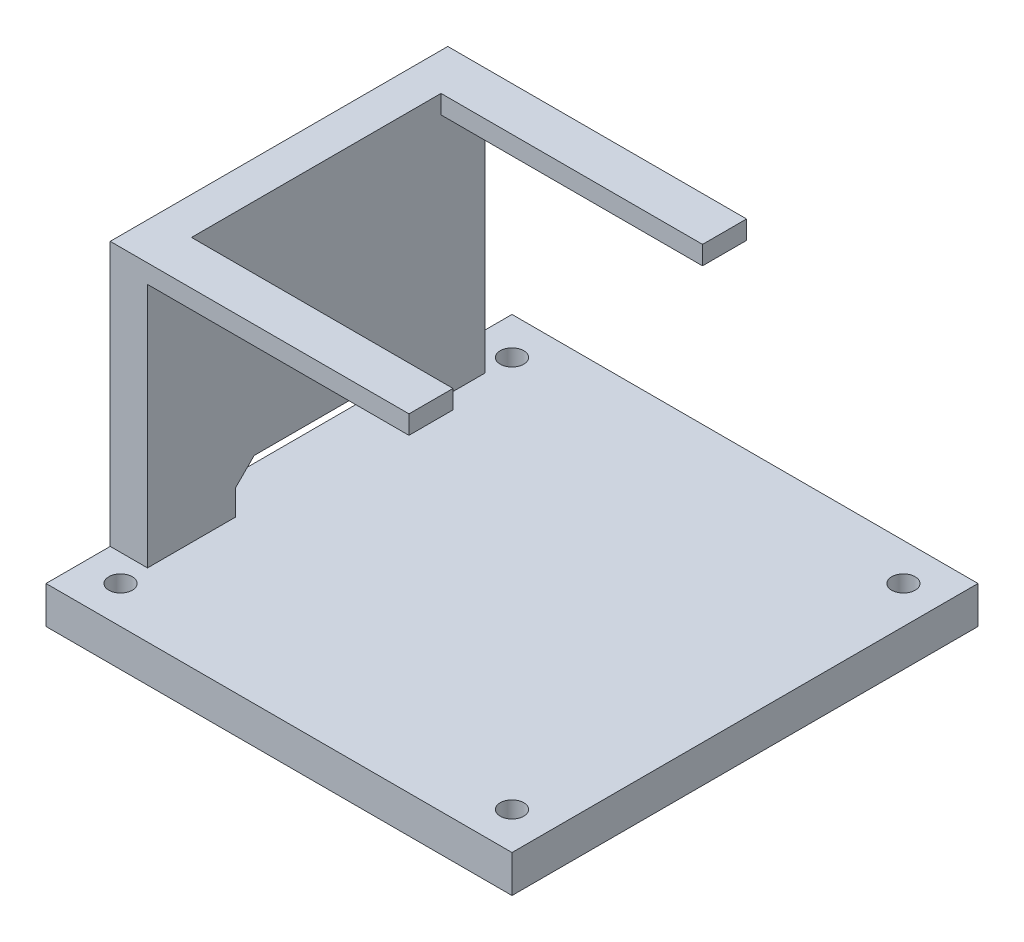
ISO-10303-21;
HEADER;
FILE_DESCRIPTION(('STEP AP214'),'2;1');
FILE_NAME('part.step','',(''),(''),'','','');
FILE_SCHEMA(('AUTOMOTIVE_DESIGN { 1 0 10303 214 1 1 1 1 }'));
ENDSEC;
DATA;
#1=APPLICATION_CONTEXT('core data for automotive mechanical design processes');
#2=APPLICATION_PROTOCOL_DEFINITION('international standard','automotive_design',2000,#1);
#3=PRODUCT_CONTEXT('',#1,'mechanical');
#4=PRODUCT('Part','Part','',(#3));
#5=PRODUCT_RELATED_PRODUCT_CATEGORY('part','',(#4));
#6=PRODUCT_DEFINITION_FORMATION('','',#4);
#7=PRODUCT_DEFINITION_CONTEXT('part definition',#1,'design');
#8=PRODUCT_DEFINITION('design','',#6,#7);
#9=PRODUCT_DEFINITION_SHAPE('','',#8);
#10=(LENGTH_UNIT() NAMED_UNIT(*) SI_UNIT(.MILLI.,.METRE.));
#11=(NAMED_UNIT(*) PLANE_ANGLE_UNIT() SI_UNIT($,.RADIAN.));
#12=(NAMED_UNIT(*) SI_UNIT($,.STERADIAN.) SOLID_ANGLE_UNIT());
#13=UNCERTAINTY_MEASURE_WITH_UNIT(LENGTH_MEASURE(1.E-05),#10,'distance_accuracy_value','');
#14=(GEOMETRIC_REPRESENTATION_CONTEXT(3) GLOBAL_UNCERTAINTY_ASSIGNED_CONTEXT((#13)) GLOBAL_UNIT_ASSIGNED_CONTEXT((#10,
#11,#12)) REPRESENTATION_CONTEXT('',''));
#15=CARTESIAN_POINT('',(0.,0.,0.));
#16=DIRECTION('',(0.,0.,1.));
#17=DIRECTION('',(1.,0.,0.));
#18=AXIS2_PLACEMENT_3D('',#15,#16,#17);
#19=CARTESIAN_POINT('',(0.,2.54,0.));
#20=DIRECTION('',(0.,-1.,0.));
#21=DIRECTION('',(0.,0.,-1.));
#22=AXIS2_PLACEMENT_3D('',#19,#20,#21);
#23=PLANE('',#22);
#24=CARTESIAN_POINT('',(13.335,2.54,-13.335));
#25=DIRECTION('',(0.,1.,0.));
#26=DIRECTION('',(0.,0.,1.));
#27=AXIS2_PLACEMENT_3D('',#24,#25,#26);
#28=CIRCLE('',#27,0.800000000000002);
#29=CARTESIAN_POINT('',(13.335,2.54,-12.535));
#30=VERTEX_POINT('',#29);
#31=EDGE_CURVE('E218',#30,#30,#28,.T.);
#32=ORIENTED_EDGE('',*,*,#31,.F.);
#33=EDGE_LOOP('',(#32));
#34=FACE_BOUND('',#33,.T.);
#35=CARTESIAN_POINT('',(-13.3350000000003,2.54,-13.335));
#36=DIRECTION('',(0.,1.,0.));
#37=DIRECTION('',(0.,0.,1.));
#38=AXIS2_PLACEMENT_3D('',#35,#36,#37);
#39=CIRCLE('',#38,0.800000000000002);
#40=CARTESIAN_POINT('',(-13.3350000000003,2.54,-12.535));
#41=VERTEX_POINT('',#40);
#42=EDGE_CURVE('E219',#41,#41,#39,.T.);
#43=ORIENTED_EDGE('',*,*,#42,.F.);
#44=EDGE_LOOP('',(#43));
#45=FACE_BOUND('',#44,.T.);
#46=CARTESIAN_POINT('',(-13.335,2.54,13.335));
#47=DIRECTION('',(0.,1.,0.));
#48=DIRECTION('',(0.,0.,1.));
#49=AXIS2_PLACEMENT_3D('',#46,#47,#48);
#50=CIRCLE('',#49,0.800000000000006);
#51=CARTESIAN_POINT('',(-13.335,2.54,14.135));
#52=VERTEX_POINT('',#51);
#53=EDGE_CURVE('E225',#52,#52,#50,.T.);
#54=ORIENTED_EDGE('',*,*,#53,.F.);
#55=EDGE_LOOP('',(#54));
#56=FACE_BOUND('',#55,.T.);
#57=CARTESIAN_POINT('',(13.3350000000003,2.54,13.335));
#58=DIRECTION('',(0.,1.,0.));
#59=DIRECTION('',(0.,0.,1.));
#60=AXIS2_PLACEMENT_3D('',#57,#58,#59);
#61=CIRCLE('',#60,0.800000000000004);
#62=CARTESIAN_POINT('',(13.3350000000003,2.54,14.135));
#63=VERTEX_POINT('',#62);
#64=EDGE_CURVE('E213',#63,#63,#61,.T.);
#65=ORIENTED_EDGE('',*,*,#64,.F.);
#66=EDGE_LOOP('',(#65));
#67=FACE_BOUND('',#66,.T.);
#68=DIRECTION('',(-1.,0.,0.));
#69=VECTOR('',#68,1.);
#70=CARTESIAN_POINT('',(-13.335,2.54,-11.500000018));
#71=LINE('',#70,#69);
#72=CARTESIAN_POINT('',(-13.335,2.54,-11.500000018));
#73=VERTEX_POINT('',#72);
#74=CARTESIAN_POINT('',(-15.875,2.54,-11.500000018));
#75=VERTEX_POINT('',#74);
#76=EDGE_CURVE('E274',#73,#75,#71,.T.);
#77=ORIENTED_EDGE('',*,*,#76,.F.);
#78=DIRECTION('',(0.,0.,-1.));
#79=VECTOR('',#78,1.);
#80=CARTESIAN_POINT('',(-13.335,2.54,11.500000018));
#81=LINE('',#80,#79);
#82=CARTESIAN_POINT('',(-13.335,2.54,-5.5));
#83=VERTEX_POINT('',#82);
#84=EDGE_CURVE('E292',#83,#73,#81,.T.);
#85=ORIENTED_EDGE('',*,*,#84,.F.);
#86=DIRECTION('',(1.,0.,0.));
#87=VECTOR('',#86,1.);
#88=CARTESIAN_POINT('',(-15.875,2.54,-5.5));
#89=LINE('',#88,#87);
#90=CARTESIAN_POINT('',(-15.875,2.54,-5.5));
#91=VERTEX_POINT('',#90);
#92=EDGE_CURVE('E176',#91,#83,#89,.T.);
#93=ORIENTED_EDGE('',*,*,#92,.F.);
#94=DIRECTION('',(0.,0.,1.));
#95=VECTOR('',#94,1.);
#96=CARTESIAN_POINT('',(-15.875,2.54,-5.5));
#97=LINE('',#96,#95);
#98=CARTESIAN_POINT('',(-15.875,2.54,5.5));
#99=VERTEX_POINT('',#98);
#100=EDGE_CURVE('E169',#91,#99,#97,.T.);
#101=ORIENTED_EDGE('',*,*,#100,.T.);
#102=DIRECTION('',(1.,0.,0.));
#103=VECTOR('',#102,1.);
#104=CARTESIAN_POINT('',(-15.875,2.54,5.5));
#105=LINE('',#104,#103);
#106=CARTESIAN_POINT('',(-13.335,2.54,5.5));
#107=VERTEX_POINT('',#106);
#108=EDGE_CURVE('E173',#99,#107,#105,.T.);
#109=ORIENTED_EDGE('',*,*,#108,.T.);
#110=CARTESIAN_POINT('',(-13.335,2.54,11.500000018));
#111=VERTEX_POINT('',#110);
#112=EDGE_CURVE('E302',#111,#107,#81,.T.);
#113=ORIENTED_EDGE('',*,*,#112,.F.);
#114=DIRECTION('',(1.,0.,0.));
#115=VECTOR('',#114,1.);
#116=CARTESIAN_POINT('',(-13.335,2.54,11.500000018));
#117=LINE('',#116,#115);
#118=CARTESIAN_POINT('',(-15.875,2.54,11.500000018));
#119=VERTEX_POINT('',#118);
#120=EDGE_CURVE('E297',#119,#111,#117,.T.);
#121=ORIENTED_EDGE('',*,*,#120,.F.);
#122=DIRECTION('',(0.,0.,1.));
#123=VECTOR('',#122,1.);
#124=CARTESIAN_POINT('',(-15.875,2.54,15.875));
#125=LINE('',#124,#123);
#126=CARTESIAN_POINT('',(-15.875,2.54,15.875));
#127=VERTEX_POINT('',#126);
#128=EDGE_CURVE('E317',#119,#127,#125,.T.);
#129=ORIENTED_EDGE('',*,*,#128,.T.);
#130=DIRECTION('',(1.,0.,0.));
#131=VECTOR('',#130,1.);
#132=CARTESIAN_POINT('',(-15.875,2.54,15.875));
#133=LINE('',#132,#131);
#134=CARTESIAN_POINT('',(15.875,2.54,15.875));
#135=VERTEX_POINT('',#134);
#136=EDGE_CURVE('E320',#127,#135,#133,.T.);
#137=ORIENTED_EDGE('',*,*,#136,.T.);
#138=DIRECTION('',(0.,0.,-1.));
#139=VECTOR('',#138,1.);
#140=CARTESIAN_POINT('',(15.875,2.54,15.875));
#141=LINE('',#140,#139);
#142=CARTESIAN_POINT('',(15.875,2.54,-15.875));
#143=VERTEX_POINT('',#142);
#144=EDGE_CURVE('E311',#135,#143,#141,.T.);
#145=ORIENTED_EDGE('',*,*,#144,.T.);
#146=DIRECTION('',(-1.,0.,0.));
#147=VECTOR('',#146,1.);
#148=CARTESIAN_POINT('',(-15.875,2.54,-15.875));
#149=LINE('',#148,#147);
#150=CARTESIAN_POINT('',(-15.875,2.54,-15.875));
#151=VERTEX_POINT('',#150);
#152=EDGE_CURVE('E314',#143,#151,#149,.T.);
#153=ORIENTED_EDGE('',*,*,#152,.T.);
#154=EDGE_CURVE('E318',#151,#75,#125,.T.);
#155=ORIENTED_EDGE('',*,*,#154,.T.);
#156=EDGE_LOOP('',(#77,#85,#93,#101,#109,#113,#121,#129,#137,#145,#153,#155));
#157=FACE_BOUND('',#156,.T.);
#158=ADVANCED_FACE('F33',(#34,#45,#56,#67,#157),#23,.F.);
#159=CARTESIAN_POINT('',(-13.335,20.54,8.500000018));
#160=DIRECTION('',(0.,0.,1.));
#161=DIRECTION('',(1.,0.,0.));
#162=AXIS2_PLACEMENT_3D('',#159,#160,#161);
#163=PLANE('',#162);
#164=DIRECTION('',(0.,-1.,0.));
#165=VECTOR('',#164,1.);
#166=CARTESIAN_POINT('',(-13.335,20.54,8.500000018));
#167=LINE('',#166,#165);
#168=CARTESIAN_POINT('',(-13.335,20.54,8.500000018));
#169=VERTEX_POINT('',#168);
#170=CARTESIAN_POINT('',(-13.335,19.27,8.500000018));
#171=VERTEX_POINT('',#170);
#172=EDGE_CURVE('E209',#169,#171,#167,.T.);
#173=ORIENTED_EDGE('',*,*,#172,.F.);
#174=DIRECTION('',(-1.,0.,0.));
#175=VECTOR('',#174,1.);
#176=CARTESIAN_POINT('',(-13.335,20.54,8.500000018));
#177=LINE('',#176,#175);
#178=CARTESIAN_POINT('',(4.48229843824764,20.5400000000001,8.499999922));
#179=VERTEX_POINT('',#178);
#180=EDGE_CURVE('E293',#179,#169,#177,.T.);
#181=ORIENTED_EDGE('',*,*,#180,.F.);
#182=DIRECTION('',(0.00193214380074869,0.999998133408425,0.));
#183=VECTOR('',#182,1.);
#184=CARTESIAN_POINT('',(4.48229843824764,20.5400000000001,8.499999922));
#185=LINE('',#184,#183);
#186=CARTESIAN_POINT('',(4.4798446110404,19.2700000000001,8.499999922));
#187=VERTEX_POINT('',#186);
#188=EDGE_CURVE('E262',#187,#179,#185,.T.);
#189=ORIENTED_EDGE('',*,*,#188,.F.);
#190=DIRECTION('',(1.,0.,0.));
#191=VECTOR('',#190,1.);
#192=CARTESIAN_POINT('',(-13.335,19.27,8.499999922));
#193=LINE('',#192,#191);
#194=EDGE_CURVE('E259',#171,#187,#193,.T.);
#195=ORIENTED_EDGE('',*,*,#194,.F.);
#196=EDGE_LOOP('',(#173,#181,#189,#195));
#197=FACE_BOUND('',#196,.T.);
#198=ADVANCED_FACE('F368',(#197),#163,.F.);
#199=CARTESIAN_POINT('',(-13.335,20.54,-8.500000018));
#200=DIRECTION('',(0.,0.,-1.));
#201=DIRECTION('',(0.,1.,0.));
#202=AXIS2_PLACEMENT_3D('',#199,#200,#201);
#203=PLANE('',#202);
#204=DIRECTION('',(0.,-1.,0.));
#205=VECTOR('',#204,1.);
#206=CARTESIAN_POINT('',(-13.335,20.54,-8.500000018));
#207=LINE('',#206,#205);
#208=CARTESIAN_POINT('',(-13.335,20.54,-8.500000018));
#209=VERTEX_POINT('',#208);
#210=CARTESIAN_POINT('',(-13.335,19.27,-8.500000018));
#211=VERTEX_POINT('',#210);
#212=EDGE_CURVE('E211',#209,#211,#207,.T.);
#213=ORIENTED_EDGE('',*,*,#212,.T.);
#214=DIRECTION('',(1.,0.,0.));
#215=VECTOR('',#214,1.);
#216=CARTESIAN_POINT('',(-13.335,19.27,-8.49999986));
#217=LINE('',#216,#215);
#218=CARTESIAN_POINT('',(4.4798446110404,19.2700000000001,-8.49999986));
#219=VERTEX_POINT('',#218);
#220=EDGE_CURVE('E236',#211,#219,#217,.T.);
#221=ORIENTED_EDGE('',*,*,#220,.T.);
#222=DIRECTION('',(0.00193214380074869,0.999998133408425,0.));
#223=VECTOR('',#222,1.);
#224=CARTESIAN_POINT('',(4.48229843824764,20.5400000000001,-8.49999986));
#225=LINE('',#224,#223);
#226=CARTESIAN_POINT('',(4.48229843824764,20.5400000000001,-8.49999986));
#227=VERTEX_POINT('',#226);
#228=EDGE_CURVE('E243',#219,#227,#225,.T.);
#229=ORIENTED_EDGE('',*,*,#228,.T.);
#230=DIRECTION('',(1.,0.,0.));
#231=VECTOR('',#230,1.);
#232=CARTESIAN_POINT('',(-13.335,20.54,-8.500000018));
#233=LINE('',#232,#231);
#234=EDGE_CURVE('E282',#209,#227,#233,.T.);
#235=ORIENTED_EDGE('',*,*,#234,.F.);
#236=EDGE_LOOP('',(#213,#221,#229,#235));
#237=FACE_BOUND('',#236,.T.);
#238=ADVANCED_FACE('F374',(#237),#203,.F.);
#239=CARTESIAN_POINT('',(15.875,2.54,15.875));
#240=DIRECTION('',(-1.,0.,0.));
#241=DIRECTION('',(0.,0.,1.));
#242=AXIS2_PLACEMENT_3D('',#239,#240,#241);
#243=PLANE('',#242);
#244=DIRECTION('',(0.,0.,-1.));
#245=VECTOR('',#244,1.);
#246=CARTESIAN_POINT('',(15.875,0.,15.875));
#247=LINE('',#246,#245);
#248=CARTESIAN_POINT('',(15.875,0.,15.875));
#249=VERTEX_POINT('',#248);
#250=CARTESIAN_POINT('',(15.875,0.,-15.875));
#251=VERTEX_POINT('',#250);
#252=EDGE_CURVE('E310',#249,#251,#247,.T.);
#253=ORIENTED_EDGE('',*,*,#252,.T.);
#254=DIRECTION('',(0.,-1.,0.));
#255=VECTOR('',#254,1.);
#256=CARTESIAN_POINT('',(15.875,2.54,-15.875));
#257=LINE('',#256,#255);
#258=EDGE_CURVE('E338',#143,#251,#257,.T.);
#259=ORIENTED_EDGE('',*,*,#258,.F.);
#260=ORIENTED_EDGE('',*,*,#144,.F.);
#261=DIRECTION('',(0.,-1.,0.));
#262=VECTOR('',#261,1.);
#263=CARTESIAN_POINT('',(15.875,2.54,15.875));
#264=LINE('',#263,#262);
#265=EDGE_CURVE('E322',#135,#249,#264,.T.);
#266=ORIENTED_EDGE('',*,*,#265,.T.);
#267=EDGE_LOOP('',(#253,#259,#260,#266));
#268=FACE_BOUND('',#267,.T.);
#269=ADVANCED_FACE('F393',(#268),#243,.F.);
#270=CARTESIAN_POINT('',(-15.875,2.54,-15.875));
#271=DIRECTION('',(0.,0.,1.));
#272=DIRECTION('',(1.,0.,0.));
#273=AXIS2_PLACEMENT_3D('',#270,#271,#272);
#274=PLANE('',#273);
#275=DIRECTION('',(-1.,0.,0.));
#276=VECTOR('',#275,1.);
#277=CARTESIAN_POINT('',(-15.875,0.,-15.875));
#278=LINE('',#277,#276);
#279=CARTESIAN_POINT('',(-15.875,0.,-15.875));
#280=VERTEX_POINT('',#279);
#281=EDGE_CURVE('E325',#251,#280,#278,.T.);
#282=ORIENTED_EDGE('',*,*,#281,.T.);
#283=DIRECTION('',(0.,-1.,0.));
#284=VECTOR('',#283,1.);
#285=CARTESIAN_POINT('',(-15.875,2.54,-15.875));
#286=LINE('',#285,#284);
#287=EDGE_CURVE('E335',#151,#280,#286,.T.);
#288=ORIENTED_EDGE('',*,*,#287,.F.);
#289=ORIENTED_EDGE('',*,*,#152,.F.);
#290=ORIENTED_EDGE('',*,*,#258,.T.);
#291=EDGE_LOOP('',(#282,#288,#289,#290));
#292=FACE_BOUND('',#291,.T.);
#293=ADVANCED_FACE('F391',(#292),#274,.F.);
#294=CARTESIAN_POINT('',(-15.875,2.54,15.875));
#295=DIRECTION('',(1.,0.,0.));
#296=DIRECTION('',(0.,0.,-1.));
#297=AXIS2_PLACEMENT_3D('',#294,#295,#296);
#298=PLANE('',#297);
#299=ORIENTED_EDGE('',*,*,#100,.F.);
#300=DIRECTION('',(0.,1.,0.));
#301=VECTOR('',#300,1.);
#302=CARTESIAN_POINT('',(-15.875,2.54,-5.5));
#303=LINE('',#302,#301);
#304=CARTESIAN_POINT('',(-15.875,4.27000000000002,-5.5));
#305=VERTEX_POINT('',#304);
#306=EDGE_CURVE('E197',#91,#305,#303,.T.);
#307=ORIENTED_EDGE('',*,*,#306,.T.);
#308=DIRECTION('',(0.,-0.707106781186544,-0.707106781186551));
#309=VECTOR('',#308,1.);
#310=CARTESIAN_POINT('',(-15.875,14.0925,4.32250000000011));
#311=LINE('',#310,#309);
#312=CARTESIAN_POINT('',(-15.875,5.54,-4.23));
#313=VERTEX_POINT('',#312);
#314=EDGE_CURVE('E11',#305,#313,#311,.F.);
#315=ORIENTED_EDGE('',*,*,#314,.T.);
#316=DIRECTION('',(0.,0.,1.));
#317=VECTOR('',#316,1.);
#318=CARTESIAN_POINT('',(-15.875,5.54,-5.5));
#319=LINE('',#318,#317);
#320=CARTESIAN_POINT('',(-15.875,5.54,4.23000000000001));
#321=VERTEX_POINT('',#320);
#322=EDGE_CURVE('E195',#313,#321,#319,.T.);
#323=ORIENTED_EDGE('',*,*,#322,.T.);
#324=DIRECTION('',(0.,-0.707106781186549,0.707106781186546));
#325=VECTOR('',#324,1.);
#326=CARTESIAN_POINT('',(-15.875,-1.7825,11.5525));
#327=LINE('',#326,#325);
#328=CARTESIAN_POINT('',(-15.875,4.27,5.5));
#329=VERTEX_POINT('',#328);
#330=EDGE_CURVE('E194',#321,#329,#327,.T.);
#331=ORIENTED_EDGE('',*,*,#330,.T.);
#332=DIRECTION('',(0.,1.,0.));
#333=VECTOR('',#332,1.);
#334=CARTESIAN_POINT('',(-15.875,2.54,5.5));
#335=LINE('',#334,#333);
#336=EDGE_CURVE('E179',#99,#329,#335,.T.);
#337=ORIENTED_EDGE('',*,*,#336,.F.);
#338=EDGE_LOOP('',(#299,#307,#315,#323,#331,#337));
#339=FACE_BOUND('',#338,.T.);
#340=DIRECTION('',(0.,0.,1.));
#341=VECTOR('',#340,1.);
#342=CARTESIAN_POINT('',(-15.875,0.,15.875));
#343=LINE('',#342,#341);
#344=CARTESIAN_POINT('',(-15.875,0.,15.875));
#345=VERTEX_POINT('',#344);
#346=EDGE_CURVE('E327',#280,#345,#343,.T.);
#347=ORIENTED_EDGE('',*,*,#346,.T.);
#348=DIRECTION('',(0.,-1.,0.));
#349=VECTOR('',#348,1.);
#350=CARTESIAN_POINT('',(-15.875,2.54,15.875));
#351=LINE('',#350,#349);
#352=EDGE_CURVE('E332',#127,#345,#351,.T.);
#353=ORIENTED_EDGE('',*,*,#352,.F.);
#354=ORIENTED_EDGE('',*,*,#128,.F.);
#355=DIRECTION('',(0.,-1.,0.));
#356=VECTOR('',#355,1.);
#357=CARTESIAN_POINT('',(-15.875,20.54,11.500000018));
#358=LINE('',#357,#356);
#359=CARTESIAN_POINT('',(-15.875,20.54,11.500000018));
#360=VERTEX_POINT('',#359);
#361=EDGE_CURVE('E307',#360,#119,#358,.T.);
#362=ORIENTED_EDGE('',*,*,#361,.F.);
#363=DIRECTION('',(0.,0.,1.));
#364=VECTOR('',#363,1.);
#365=CARTESIAN_POINT('',(-15.875,20.54,8.500000018));
#366=LINE('',#365,#364);
#367=CARTESIAN_POINT('',(-15.875,20.54,-11.500000018));
#368=VERTEX_POINT('',#367);
#369=EDGE_CURVE('E296',#368,#360,#366,.T.);
#370=ORIENTED_EDGE('',*,*,#369,.F.);
#371=DIRECTION('',(0.,-1.,0.));
#372=VECTOR('',#371,1.);
#373=CARTESIAN_POINT('',(-15.875,20.54,-11.500000018));
#374=LINE('',#373,#372);
#375=EDGE_CURVE('E284',#368,#75,#374,.T.);
#376=ORIENTED_EDGE('',*,*,#375,.T.);
#377=ORIENTED_EDGE('',*,*,#154,.F.);
#378=ORIENTED_EDGE('',*,*,#287,.T.);
#379=EDGE_LOOP('',(#347,#353,#354,#362,#370,#376,#377,#378));
#380=FACE_BOUND('',#379,.T.);
#381=ADVANCED_FACE('F190',(#339,#380),#298,.F.);
#382=CARTESIAN_POINT('',(-15.875,2.54,15.875));
#383=DIRECTION('',(0.,0.,-1.));
#384=DIRECTION('',(-1.,0.,0.));
#385=AXIS2_PLACEMENT_3D('',#382,#383,#384);
#386=PLANE('',#385);
#387=DIRECTION('',(1.,0.,0.));
#388=VECTOR('',#387,1.);
#389=CARTESIAN_POINT('',(-15.875,0.,15.875));
#390=LINE('',#389,#388);
#391=EDGE_CURVE('E315',#345,#249,#390,.T.);
#392=ORIENTED_EDGE('',*,*,#391,.T.);
#393=ORIENTED_EDGE('',*,*,#265,.F.);
#394=ORIENTED_EDGE('',*,*,#136,.F.);
#395=ORIENTED_EDGE('',*,*,#352,.T.);
#396=EDGE_LOOP('',(#392,#393,#394,#395));
#397=FACE_BOUND('',#396,.T.);
#398=ADVANCED_FACE('F384',(#397),#386,.F.);
#399=CARTESIAN_POINT('',(0.,0.,0.));
#400=DIRECTION('',(0.,-1.,0.));
#401=DIRECTION('',(0.,0.,-1.));
#402=AXIS2_PLACEMENT_3D('',#399,#400,#401);
#403=PLANE('',#402);
#404=CARTESIAN_POINT('',(13.3350000000003,0.,13.335));
#405=DIRECTION('',(0.,1.,0.));
#406=DIRECTION('',(0.,0.,1.));
#407=AXIS2_PLACEMENT_3D('',#404,#405,#406);
#408=CIRCLE('',#407,0.800000000000004);
#409=CARTESIAN_POINT('',(13.3350000000003,0.,14.135));
#410=VERTEX_POINT('',#409);
#411=EDGE_CURVE('E228',#410,#410,#408,.T.);
#412=ORIENTED_EDGE('',*,*,#411,.T.);
#413=EDGE_LOOP('',(#412));
#414=FACE_BOUND('',#413,.T.);
#415=CARTESIAN_POINT('',(-13.335,0.,13.335));
#416=DIRECTION('',(0.,1.,0.));
#417=DIRECTION('',(0.,0.,1.));
#418=AXIS2_PLACEMENT_3D('',#415,#416,#417);
#419=CIRCLE('',#418,0.800000000000006);
#420=CARTESIAN_POINT('',(-13.335,0.,14.135));
#421=VERTEX_POINT('',#420);
#422=EDGE_CURVE('E222',#421,#421,#419,.T.);
#423=ORIENTED_EDGE('',*,*,#422,.T.);
#424=EDGE_LOOP('',(#423));
#425=FACE_BOUND('',#424,.T.);
#426=CARTESIAN_POINT('',(-13.3350000000003,0.,-13.335));
#427=DIRECTION('',(0.,1.,0.));
#428=DIRECTION('',(0.,0.,1.));
#429=AXIS2_PLACEMENT_3D('',#426,#427,#428);
#430=CIRCLE('',#429,0.800000000000002);
#431=CARTESIAN_POINT('',(-13.3350000000003,0.,-12.535));
#432=VERTEX_POINT('',#431);
#433=EDGE_CURVE('E215',#432,#432,#430,.T.);
#434=ORIENTED_EDGE('',*,*,#433,.T.);
#435=EDGE_LOOP('',(#434));
#436=FACE_BOUND('',#435,.T.);
#437=CARTESIAN_POINT('',(13.335,0.,-13.335));
#438=DIRECTION('',(0.,1.,0.));
#439=DIRECTION('',(0.,0.,1.));
#440=AXIS2_PLACEMENT_3D('',#437,#438,#439);
#441=CIRCLE('',#440,0.800000000000002);
#442=CARTESIAN_POINT('',(13.335,0.,-12.535));
#443=VERTEX_POINT('',#442);
#444=EDGE_CURVE('E233',#443,#443,#441,.T.);
#445=ORIENTED_EDGE('',*,*,#444,.T.);
#446=EDGE_LOOP('',(#445));
#447=FACE_BOUND('',#446,.T.);
#448=ORIENTED_EDGE('',*,*,#252,.F.);
#449=ORIENTED_EDGE('',*,*,#391,.F.);
#450=ORIENTED_EDGE('',*,*,#346,.F.);
#451=ORIENTED_EDGE('',*,*,#281,.F.);
#452=EDGE_LOOP('',(#448,#449,#450,#451));
#453=FACE_BOUND('',#452,.T.);
#454=ADVANCED_FACE('F381',(#414,#425,#436,#447,#453),#403,.T.);
#455=CARTESIAN_POINT('',(-13.335,20.54,11.500000018));
#456=DIRECTION('',(-1.,0.,0.));
#457=DIRECTION('',(0.,0.,1.));
#458=AXIS2_PLACEMENT_3D('',#455,#456,#457);
#459=PLANE('',#458);
#460=DIRECTION('',(0.,0.,1.));
#461=VECTOR('',#460,1.);
#462=CARTESIAN_POINT('',(-13.335,5.54,-5.5));
#463=LINE('',#462,#461);
#464=CARTESIAN_POINT('',(-13.335,5.54,-4.23));
#465=VERTEX_POINT('',#464);
#466=CARTESIAN_POINT('',(-13.335,5.54,4.23000000000001));
#467=VERTEX_POINT('',#466);
#468=EDGE_CURVE('E203',#465,#467,#463,.T.);
#469=ORIENTED_EDGE('',*,*,#468,.F.);
#470=DIRECTION('',(0.,0.707106781186544,0.707106781186551));
#471=VECTOR('',#470,1.);
#472=CARTESIAN_POINT('',(-13.335,20.9050000089999,11.1350000090001));
#473=LINE('',#472,#471);
#474=CARTESIAN_POINT('',(-13.335,4.27000000000002,-5.5));
#475=VERTEX_POINT('',#474);
#476=EDGE_CURVE('E41',#465,#475,#473,.F.);
#477=ORIENTED_EDGE('',*,*,#476,.T.);
#478=DIRECTION('',(0.,1.,0.));
#479=VECTOR('',#478,1.);
#480=CARTESIAN_POINT('',(-13.335,2.54,-5.5));
#481=LINE('',#480,#479);
#482=EDGE_CURVE('E201',#83,#475,#481,.T.);
#483=ORIENTED_EDGE('',*,*,#482,.F.);
#484=ORIENTED_EDGE('',*,*,#84,.T.);
#485=DIRECTION('',(0.,-1.,0.));
#486=VECTOR('',#485,1.);
#487=CARTESIAN_POINT('',(-13.335,20.54,-11.500000018));
#488=LINE('',#487,#486);
#489=CARTESIAN_POINT('',(-13.335,19.27,-11.499999956));
#490=VERTEX_POINT('',#489);
#491=EDGE_CURVE('E289',#490,#73,#488,.T.);
#492=ORIENTED_EDGE('',*,*,#491,.F.);
#493=DIRECTION('',(0.,0.,1.));
#494=VECTOR('',#493,1.);
#495=CARTESIAN_POINT('',(-13.335,19.27,-11.499999956));
#496=LINE('',#495,#494);
#497=EDGE_CURVE('E246',#490,#211,#496,.T.);
#498=ORIENTED_EDGE('',*,*,#497,.T.);
#499=ORIENTED_EDGE('',*,*,#212,.F.);
#500=DIRECTION('',(0.,0.,1.));
#501=VECTOR('',#500,1.);
#502=CARTESIAN_POINT('',(-13.335,20.54,-26.6783277738746));
#503=LINE('',#502,#501);
#504=EDGE_CURVE('E207',#209,#169,#503,.T.);
#505=ORIENTED_EDGE('',*,*,#504,.T.);
#506=ORIENTED_EDGE('',*,*,#172,.T.);
#507=DIRECTION('',(0.,0.,1.));
#508=VECTOR('',#507,1.);
#509=CARTESIAN_POINT('',(-13.335,19.27,8.499999922));
#510=LINE('',#509,#508);
#511=CARTESIAN_POINT('',(-13.335,19.27,11.500000018));
#512=VERTEX_POINT('',#511);
#513=EDGE_CURVE('E266',#171,#512,#510,.T.);
#514=ORIENTED_EDGE('',*,*,#513,.T.);
#515=DIRECTION('',(0.,-1.,0.));
#516=VECTOR('',#515,1.);
#517=CARTESIAN_POINT('',(-13.335,20.54,11.500000018));
#518=LINE('',#517,#516);
#519=EDGE_CURVE('E301',#512,#111,#518,.T.);
#520=ORIENTED_EDGE('',*,*,#519,.T.);
#521=ORIENTED_EDGE('',*,*,#112,.T.);
#522=DIRECTION('',(0.,1.,0.));
#523=VECTOR('',#522,1.);
#524=CARTESIAN_POINT('',(-13.335,2.54,5.5));
#525=LINE('',#524,#523);
#526=CARTESIAN_POINT('',(-13.335,4.27,5.5));
#527=VERTEX_POINT('',#526);
#528=EDGE_CURVE('E187',#107,#527,#525,.T.);
#529=ORIENTED_EDGE('',*,*,#528,.T.);
#530=DIRECTION('',(0.,0.707106781186549,-0.707106781186546));
#531=VECTOR('',#530,1.);
#532=CARTESIAN_POINT('',(-13.335,9.40499999100004,0.365000008999987));
#533=LINE('',#532,#531);
#534=EDGE_CURVE('E349',#527,#467,#533,.T.);
#535=ORIENTED_EDGE('',*,*,#534,.T.);
#536=EDGE_LOOP('',(#469,#477,#483,#484,#492,#498,#499,#505,#506,#514,#520,#521,#529,#535));
#537=FACE_BOUND('',#536,.T.);
#538=ADVANCED_FACE('F351',(#537),#459,.F.);
#539=CARTESIAN_POINT('',(-13.335,20.54,11.500000018));
#540=DIRECTION('',(0.,0.,-1.));
#541=DIRECTION('',(0.,1.,0.));
#542=AXIS2_PLACEMENT_3D('',#539,#540,#541);
#543=PLANE('',#542);
#544=ORIENTED_EDGE('',*,*,#120,.T.);
#545=ORIENTED_EDGE('',*,*,#519,.F.);
#546=DIRECTION('',(1.,0.,0.));
#547=VECTOR('',#546,1.);
#548=CARTESIAN_POINT('',(-13.335,19.27,11.500000018));
#549=LINE('',#548,#547);
#550=CARTESIAN_POINT('',(4.4798446110404,19.2700000000001,11.500000018));
#551=VERTEX_POINT('',#550);
#552=EDGE_CURVE('E254',#512,#551,#549,.T.);
#553=ORIENTED_EDGE('',*,*,#552,.T.);
#554=DIRECTION('',(0.00193214380074869,0.999998133408425,0.));
#555=VECTOR('',#554,1.);
#556=CARTESIAN_POINT('',(4.48229843824764,20.5400000000001,11.500000018));
#557=LINE('',#556,#555);
#558=CARTESIAN_POINT('',(4.48229843824764,20.5400000000001,11.500000018));
#559=VERTEX_POINT('',#558);
#560=EDGE_CURVE('E263',#551,#559,#557,.T.);
#561=ORIENTED_EDGE('',*,*,#560,.T.);
#562=DIRECTION('',(1.,0.,0.));
#563=VECTOR('',#562,1.);
#564=CARTESIAN_POINT('',(-13.335,20.54,11.500000018));
#565=LINE('',#564,#563);
#566=EDGE_CURVE('E299',#360,#559,#565,.T.);
#567=ORIENTED_EDGE('',*,*,#566,.F.);
#568=ORIENTED_EDGE('',*,*,#361,.T.);
#569=EDGE_LOOP('',(#544,#545,#553,#561,#567,#568));
#570=FACE_BOUND('',#569,.T.);
#571=ADVANCED_FACE('F467',(#570),#543,.F.);
#572=CARTESIAN_POINT('',(0.,20.54,0.));
#573=DIRECTION('',(0.,1.,0.));
#574=DIRECTION('',(0.,0.,1.));
#575=AXIS2_PLACEMENT_3D('',#572,#573,#574);
#576=PLANE('',#575);
#577=ORIENTED_EDGE('',*,*,#566,.T.);
#578=DIRECTION('',(0.,0.,1.));
#579=VECTOR('',#578,1.);
#580=CARTESIAN_POINT('',(4.48229843824764,20.5400000000001,8.499999922));
#581=LINE('',#580,#579);
#582=EDGE_CURVE('E271',#179,#559,#581,.T.);
#583=ORIENTED_EDGE('',*,*,#582,.F.);
#584=ORIENTED_EDGE('',*,*,#180,.T.);
#585=ORIENTED_EDGE('',*,*,#504,.F.);
#586=ORIENTED_EDGE('',*,*,#234,.T.);
#587=DIRECTION('',(0.,0.,1.));
#588=VECTOR('',#587,1.);
#589=CARTESIAN_POINT('',(4.48229843824764,20.5400000000001,-11.499999956));
#590=LINE('',#589,#588);
#591=CARTESIAN_POINT('',(4.48229843824764,20.5400000000001,-11.499999956));
#592=VERTEX_POINT('',#591);
#593=EDGE_CURVE('E251',#592,#227,#590,.T.);
#594=ORIENTED_EDGE('',*,*,#593,.F.);
#595=DIRECTION('',(-1.,0.,0.));
#596=VECTOR('',#595,1.);
#597=CARTESIAN_POINT('',(-13.335,20.54,-11.500000018));
#598=LINE('',#597,#596);
#599=EDGE_CURVE('E279',#592,#368,#598,.T.);
#600=ORIENTED_EDGE('',*,*,#599,.T.);
#601=ORIENTED_EDGE('',*,*,#369,.T.);
#602=EDGE_LOOP('',(#577,#583,#584,#585,#586,#594,#600,#601));
#603=FACE_BOUND('',#602,.T.);
#604=ADVANCED_FACE('F464',(#603),#576,.T.);
#605=CARTESIAN_POINT('',(-13.335,20.54,-11.500000018));
#606=DIRECTION('',(0.,0.,1.));
#607=DIRECTION('',(0.,-1.,0.));
#608=AXIS2_PLACEMENT_3D('',#605,#606,#607);
#609=PLANE('',#608);
#610=ORIENTED_EDGE('',*,*,#76,.T.);
#611=ORIENTED_EDGE('',*,*,#375,.F.);
#612=ORIENTED_EDGE('',*,*,#599,.F.);
#613=DIRECTION('',(0.00193214380074869,0.999998133408425,0.));
#614=VECTOR('',#613,1.);
#615=CARTESIAN_POINT('',(4.48229843824764,20.5400000000001,-11.499999956));
#616=LINE('',#615,#614);
#617=CARTESIAN_POINT('',(4.4798446110404,19.2700000000001,-11.499999956));
#618=VERTEX_POINT('',#617);
#619=EDGE_CURVE('E242',#618,#592,#616,.T.);
#620=ORIENTED_EDGE('',*,*,#619,.F.);
#621=DIRECTION('',(1.,0.,0.));
#622=VECTOR('',#621,1.);
#623=CARTESIAN_POINT('',(-13.335,19.27,-11.499999956));
#624=LINE('',#623,#622);
#625=EDGE_CURVE('E239',#490,#618,#624,.T.);
#626=ORIENTED_EDGE('',*,*,#625,.F.);
#627=ORIENTED_EDGE('',*,*,#491,.T.);
#628=EDGE_LOOP('',(#610,#611,#612,#620,#626,#627));
#629=FACE_BOUND('',#628,.T.);
#630=ADVANCED_FACE('F417',(#629),#609,.F.);
#631=CARTESIAN_POINT('',(4.48229843824764,20.5400000000001,8.499999922));
#632=DIRECTION('',(0.999998133408425,-0.00193214380074869,0.));
#633=DIRECTION('',(0.00193214380074869,0.999998133408425,0.));
#634=AXIS2_PLACEMENT_3D('',#631,#632,#633);
#635=PLANE('',#634);
#636=ORIENTED_EDGE('',*,*,#560,.F.);
#637=DIRECTION('',(0.,0.,1.));
#638=VECTOR('',#637,1.);
#639=CARTESIAN_POINT('',(4.4798446110404,19.2700000000001,8.499999922));
#640=LINE('',#639,#638);
#641=EDGE_CURVE('E275',#187,#551,#640,.T.);
#642=ORIENTED_EDGE('',*,*,#641,.F.);
#643=ORIENTED_EDGE('',*,*,#188,.T.);
#644=ORIENTED_EDGE('',*,*,#582,.T.);
#645=EDGE_LOOP('',(#636,#642,#643,#644));
#646=FACE_BOUND('',#645,.T.);
#647=ADVANCED_FACE('F455',(#646),#635,.T.);
#648=CARTESIAN_POINT('',(-13.335,19.27,8.499999922));
#649=DIRECTION('',(0.,-1.,0.));
#650=DIRECTION('',(1.,0.,0.));
#651=AXIS2_PLACEMENT_3D('',#648,#649,#650);
#652=PLANE('',#651);
#653=ORIENTED_EDGE('',*,*,#552,.F.);
#654=ORIENTED_EDGE('',*,*,#513,.F.);
#655=ORIENTED_EDGE('',*,*,#194,.T.);
#656=ORIENTED_EDGE('',*,*,#641,.T.);
#657=EDGE_LOOP('',(#653,#654,#655,#656));
#658=FACE_BOUND('',#657,.T.);
#659=ADVANCED_FACE('F450',(#658),#652,.T.);
#660=CARTESIAN_POINT('',(4.48229843824764,20.5400000000001,-11.499999956));
#661=DIRECTION('',(0.999998133408425,-0.00193214380074869,0.));
#662=DIRECTION('',(0.00193214380074869,0.999998133408425,0.));
#663=AXIS2_PLACEMENT_3D('',#660,#661,#662);
#664=PLANE('',#663);
#665=ORIENTED_EDGE('',*,*,#228,.F.);
#666=DIRECTION('',(0.,0.,1.));
#667=VECTOR('',#666,1.);
#668=CARTESIAN_POINT('',(4.4798446110404,19.2700000000001,-11.499999956));
#669=LINE('',#668,#667);
#670=EDGE_CURVE('E255',#618,#219,#669,.T.);
#671=ORIENTED_EDGE('',*,*,#670,.F.);
#672=ORIENTED_EDGE('',*,*,#619,.T.);
#673=ORIENTED_EDGE('',*,*,#593,.T.);
#674=EDGE_LOOP('',(#665,#671,#672,#673));
#675=FACE_BOUND('',#674,.T.);
#676=ADVANCED_FACE('F447',(#675),#664,.T.);
#677=CARTESIAN_POINT('',(-13.335,19.27,-11.499999956));
#678=DIRECTION('',(0.,-1.,0.));
#679=DIRECTION('',(1.,0.,0.));
#680=AXIS2_PLACEMENT_3D('',#677,#678,#679);
#681=PLANE('',#680);
#682=ORIENTED_EDGE('',*,*,#220,.F.);
#683=ORIENTED_EDGE('',*,*,#497,.F.);
#684=ORIENTED_EDGE('',*,*,#625,.T.);
#685=ORIENTED_EDGE('',*,*,#670,.T.);
#686=EDGE_LOOP('',(#682,#683,#684,#685));
#687=FACE_BOUND('',#686,.T.);
#688=ADVANCED_FACE('F445',(#687),#681,.T.);
#689=CARTESIAN_POINT('',(13.335,0.,-13.335));
#690=DIRECTION('',(0.,1.,0.));
#691=DIRECTION('',(0.,0.,1.));
#692=AXIS2_PLACEMENT_3D('',#689,#690,#691);
#693=CYLINDRICAL_SURFACE('',#692,0.800000000000002);
#694=ORIENTED_EDGE('',*,*,#444,.F.);
#695=EDGE_LOOP('',(#694));
#696=FACE_BOUND('',#695,.T.);
#697=ORIENTED_EDGE('',*,*,#31,.T.);
#698=EDGE_LOOP('',(#697));
#699=FACE_BOUND('',#698,.T.);
#700=ADVANCED_FACE('F438',(#696,#699),#693,.F.);
#701=CARTESIAN_POINT('',(-13.3350000000003,0.,-13.335));
#702=DIRECTION('',(0.,1.,0.));
#703=DIRECTION('',(0.,0.,1.));
#704=AXIS2_PLACEMENT_3D('',#701,#702,#703);
#705=CYLINDRICAL_SURFACE('',#704,0.800000000000002);
#706=ORIENTED_EDGE('',*,*,#433,.F.);
#707=EDGE_LOOP('',(#706));
#708=FACE_BOUND('',#707,.T.);
#709=ORIENTED_EDGE('',*,*,#42,.T.);
#710=EDGE_LOOP('',(#709));
#711=FACE_BOUND('',#710,.T.);
#712=ADVANCED_FACE('F435',(#708,#711),#705,.F.);
#713=CARTESIAN_POINT('',(-13.335,0.,13.335));
#714=DIRECTION('',(0.,1.,0.));
#715=DIRECTION('',(0.,0.,1.));
#716=AXIS2_PLACEMENT_3D('',#713,#714,#715);
#717=CYLINDRICAL_SURFACE('',#716,0.800000000000006);
#718=ORIENTED_EDGE('',*,*,#422,.F.);
#719=EDGE_LOOP('',(#718));
#720=FACE_BOUND('',#719,.T.);
#721=ORIENTED_EDGE('',*,*,#53,.T.);
#722=EDGE_LOOP('',(#721));
#723=FACE_BOUND('',#722,.T.);
#724=ADVANCED_FACE('F431',(#720,#723),#717,.F.);
#725=CARTESIAN_POINT('',(13.3350000000003,0.,13.335));
#726=DIRECTION('',(0.,1.,0.));
#727=DIRECTION('',(0.,0.,1.));
#728=AXIS2_PLACEMENT_3D('',#725,#726,#727);
#729=CYLINDRICAL_SURFACE('',#728,0.800000000000004);
#730=ORIENTED_EDGE('',*,*,#411,.F.);
#731=EDGE_LOOP('',(#730));
#732=FACE_BOUND('',#731,.T.);
#733=ORIENTED_EDGE('',*,*,#64,.T.);
#734=EDGE_LOOP('',(#733));
#735=FACE_BOUND('',#734,.T.);
#736=ADVANCED_FACE('F424',(#732,#735),#729,.F.);
#737=CARTESIAN_POINT('',(-15.875,2.54,-5.5));
#738=DIRECTION('',(0.,0.,-1.));
#739=DIRECTION('',(-1.,0.,0.));
#740=AXIS2_PLACEMENT_3D('',#737,#738,#739);
#741=PLANE('',#740);
#742=ORIENTED_EDGE('',*,*,#482,.T.);
#743=DIRECTION('',(-1.,0.,0.));
#744=VECTOR('',#743,1.);
#745=CARTESIAN_POINT('',(-15.875,4.27000000000002,-5.5));
#746=LINE('',#745,#744);
#747=EDGE_CURVE('E48',#475,#305,#746,.T.);
#748=ORIENTED_EDGE('',*,*,#747,.T.);
#749=ORIENTED_EDGE('',*,*,#306,.F.);
#750=ORIENTED_EDGE('',*,*,#92,.T.);
#751=EDGE_LOOP('',(#742,#748,#749,#750));
#752=FACE_BOUND('',#751,.T.);
#753=ADVANCED_FACE('F421',(#752),#741,.F.);
#754=CARTESIAN_POINT('',(-15.875,2.54,5.5));
#755=DIRECTION('',(0.,0.,-1.));
#756=DIRECTION('',(-1.,0.,0.));
#757=AXIS2_PLACEMENT_3D('',#754,#755,#756);
#758=PLANE('',#757);
#759=ORIENTED_EDGE('',*,*,#336,.T.);
#760=DIRECTION('',(1.,0.,0.));
#761=VECTOR('',#760,1.);
#762=CARTESIAN_POINT('',(-15.875,4.27,5.5));
#763=LINE('',#762,#761);
#764=EDGE_CURVE('E341',#329,#527,#763,.T.);
#765=ORIENTED_EDGE('',*,*,#764,.T.);
#766=ORIENTED_EDGE('',*,*,#528,.F.);
#767=ORIENTED_EDGE('',*,*,#108,.F.);
#768=EDGE_LOOP('',(#759,#765,#766,#767));
#769=FACE_BOUND('',#768,.T.);
#770=ADVANCED_FACE('F183',(#769),#758,.T.);
#771=CARTESIAN_POINT('',(-15.875,5.54,-5.5));
#772=DIRECTION('',(0.,1.,0.));
#773=DIRECTION('',(0.,0.,1.));
#774=AXIS2_PLACEMENT_3D('',#771,#772,#773);
#775=PLANE('',#774);
#776=ORIENTED_EDGE('',*,*,#468,.T.);
#777=DIRECTION('',(-1.,0.,0.));
#778=VECTOR('',#777,1.);
#779=CARTESIAN_POINT('',(-15.875,5.54,4.23000000000001));
#780=LINE('',#779,#778);
#781=EDGE_CURVE('E346',#467,#321,#780,.T.);
#782=ORIENTED_EDGE('',*,*,#781,.T.);
#783=ORIENTED_EDGE('',*,*,#322,.F.);
#784=DIRECTION('',(1.,0.,0.));
#785=VECTOR('',#784,1.);
#786=CARTESIAN_POINT('',(-13.335,5.54,-4.23));
#787=LINE('',#786,#785);
#788=EDGE_CURVE('E343',#313,#465,#787,.T.);
#789=ORIENTED_EDGE('',*,*,#788,.T.);
#790=EDGE_LOOP('',(#776,#782,#783,#789));
#791=FACE_BOUND('',#790,.T.);
#792=ADVANCED_FACE('F355',(#791),#775,.F.);
#793=CARTESIAN_POINT('',(-15.875,4.27,5.5));
#794=DIRECTION('',(0.,0.707106781186546,0.707106781186549));
#795=DIRECTION('',(1.,0.,0.));
#796=AXIS2_PLACEMENT_3D('',#793,#794,#795);
#797=PLANE('',#796);
#798=ORIENTED_EDGE('',*,*,#330,.F.);
#799=ORIENTED_EDGE('',*,*,#781,.F.);
#800=ORIENTED_EDGE('',*,*,#534,.F.);
#801=ORIENTED_EDGE('',*,*,#764,.F.);
#802=EDGE_LOOP('',(#798,#799,#800,#801));
#803=FACE_BOUND('',#802,.T.);
#804=ADVANCED_FACE('F358',(#803),#797,.F.);
#805=CARTESIAN_POINT('',(-15.875,5.54,-4.23));
#806=DIRECTION('',(0.,-0.707106781186551,0.707106781186544));
#807=DIRECTION('',(-1.,0.,0.));
#808=AXIS2_PLACEMENT_3D('',#805,#806,#807);
#809=PLANE('',#808);
#810=ORIENTED_EDGE('',*,*,#314,.F.);
#811=ORIENTED_EDGE('',*,*,#747,.F.);
#812=ORIENTED_EDGE('',*,*,#476,.F.);
#813=ORIENTED_EDGE('',*,*,#788,.F.);
#814=EDGE_LOOP('',(#810,#811,#812,#813));
#815=FACE_BOUND('',#814,.T.);
#816=ADVANCED_FACE('F35',(#815),#809,.T.);
#817=CLOSED_SHELL('',(#158,#198,#238,#269,#293,#381,#398,#454,#538,#571,#604,#630,#647,#659,
#676,#688,#700,#712,#724,#736,#753,#770,#792,#804,#816));
#818=MANIFOLD_SOLID_BREP('B2',#817);
#819=ADVANCED_BREP_SHAPE_REPRESENTATION('',(#18,#818),#14);
#820=SHAPE_DEFINITION_REPRESENTATION(#9,#819);
ENDSEC;
END-ISO-10303-21;
